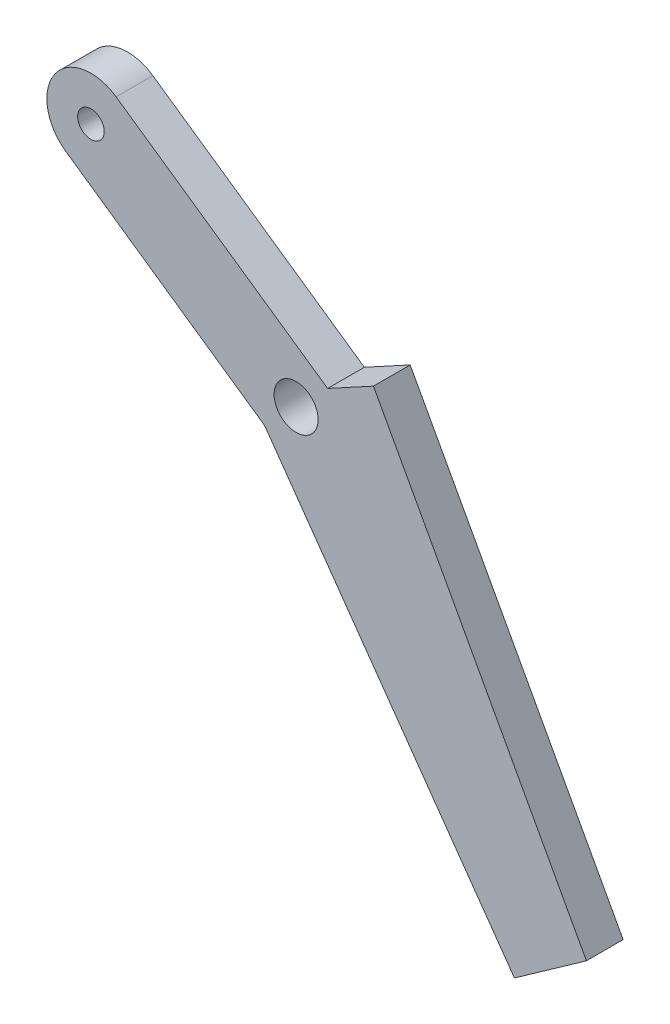
ISO-10303-21;
HEADER;
FILE_DESCRIPTION(('STEP AP214'),'2;1');
FILE_NAME('part.step','',(''),(''),'','','');
FILE_SCHEMA(('AUTOMOTIVE_DESIGN { 1 0 10303 214 1 1 1 1 }'));
ENDSEC;
DATA;
#1=APPLICATION_CONTEXT('core data for automotive mechanical design processes');
#2=APPLICATION_PROTOCOL_DEFINITION('international standard','automotive_design',2000,#1);
#3=PRODUCT_CONTEXT('',#1,'mechanical');
#4=PRODUCT('Part','Part','',(#3));
#5=PRODUCT_RELATED_PRODUCT_CATEGORY('part','',(#4));
#6=PRODUCT_DEFINITION_FORMATION('','',#4);
#7=PRODUCT_DEFINITION_CONTEXT('part definition',#1,'design');
#8=PRODUCT_DEFINITION('design','',#6,#7);
#9=PRODUCT_DEFINITION_SHAPE('','',#8);
#10=(LENGTH_UNIT() NAMED_UNIT(*) SI_UNIT(.MILLI.,.METRE.));
#11=(NAMED_UNIT(*) PLANE_ANGLE_UNIT() SI_UNIT($,.RADIAN.));
#12=(NAMED_UNIT(*) SI_UNIT($,.STERADIAN.) SOLID_ANGLE_UNIT());
#13=UNCERTAINTY_MEASURE_WITH_UNIT(LENGTH_MEASURE(1.E-05),#10,'distance_accuracy_value','');
#14=(GEOMETRIC_REPRESENTATION_CONTEXT(3) GLOBAL_UNCERTAINTY_ASSIGNED_CONTEXT((#13)) GLOBAL_UNIT_ASSIGNED_CONTEXT((#10,
#11,#12)) REPRESENTATION_CONTEXT('',''));
#15=CARTESIAN_POINT('',(0.,0.,0.));
#16=DIRECTION('',(0.,0.,1.));
#17=DIRECTION('',(1.,0.,0.));
#18=AXIS2_PLACEMENT_3D('',#15,#16,#17);
#19=CARTESIAN_POINT('',(36.7403272001533,52.945063432731,2.5));
#20=DIRECTION('',(0.570112302985173,0.821566772687979,0.));
#21=DIRECTION('',(-0.821566772687979,0.570112302985173,0.));
#22=AXIS2_PLACEMENT_3D('',#19,#20,#21);
#23=PLANE('',#22);
#24=DIRECTION('',(0.821566772687979,-0.570112302985173,0.));
#25=VECTOR('',#24,1.);
#26=CARTESIAN_POINT('',(36.7403272001533,52.945063432731,0.));
#27=LINE('',#26,#25);
#28=CARTESIAN_POINT('',(176.598168195802,-44.1069090559931,0.));
#29=VERTEX_POINT('',#28);
#30=CARTESIAN_POINT('',(190.999396496933,-54.1003967498914,0.));
#31=VERTEX_POINT('',#30);
#32=EDGE_CURVE('E142',#29,#31,#27,.T.);
#33=ORIENTED_EDGE('',*,*,#32,.F.);
#34=DIRECTION('',(0.,0.,-1.));
#35=VECTOR('',#34,1.);
#36=CARTESIAN_POINT('',(176.598168195802,-44.1069090559931,2.5));
#37=LINE('',#36,#35);
#38=CARTESIAN_POINT('',(176.598168195802,-44.1069090559931,2.5));
#39=VERTEX_POINT('',#38);
#40=EDGE_CURVE('E11',#39,#29,#37,.T.);
#41=ORIENTED_EDGE('',*,*,#40,.F.);
#42=DIRECTION('',(0.821566772687979,-0.570112302985173,0.));
#43=VECTOR('',#42,1.);
#44=CARTESIAN_POINT('',(36.7403272001533,52.945063432731,2.5));
#45=LINE('',#44,#43);
#46=CARTESIAN_POINT('',(190.999396496933,-54.1003967498914,2.5));
#47=VERTEX_POINT('',#46);
#48=EDGE_CURVE('E206',#39,#47,#45,.T.);
#49=ORIENTED_EDGE('',*,*,#48,.T.);
#50=DIRECTION('',(0.,0.,-1.));
#51=VECTOR('',#50,1.);
#52=CARTESIAN_POINT('',(190.999396496933,-54.1003967498914,2.5));
#53=LINE('',#52,#51);
#54=EDGE_CURVE('E52',#47,#31,#53,.T.);
#55=ORIENTED_EDGE('',*,*,#54,.T.);
#56=EDGE_LOOP('',(#33,#41,#49,#55));
#57=FACE_BOUND('',#56,.T.);
#58=ADVANCED_FACE('F35',(#57),#23,.T.);
#59=CARTESIAN_POINT('',(174.887831286847,-46.571609374057,2.5));
#60=DIRECTION('',(0.,0.,-1.));
#61=DIRECTION('',(-1.,0.,0.));
#62=AXIS2_PLACEMENT_3D('',#59,#60,#61);
#63=CYLINDRICAL_SURFACE('',#62,2.99999999999999);
#64=CARTESIAN_POINT('',(174.887831286847,-46.571609374057,0.));
#65=DIRECTION('',(0.,0.,1.));
#66=DIRECTION('',(1.,0.,0.));
#67=AXIS2_PLACEMENT_3D('',#64,#65,#66);
#68=CIRCLE('',#67,2.99999999999999);
#69=CARTESIAN_POINT('',(173.177494377891,-49.036309692121,0.));
#70=VERTEX_POINT('',#69);
#71=EDGE_CURVE('E139',#29,#70,#68,.T.);
#72=ORIENTED_EDGE('',*,*,#71,.T.);
#73=DIRECTION('',(0.,0.,-1.));
#74=VECTOR('',#73,1.);
#75=CARTESIAN_POINT('',(173.177494377891,-49.036309692121,2.5));
#76=LINE('',#75,#74);
#77=CARTESIAN_POINT('',(173.177494377891,-49.036309692121,2.5));
#78=VERTEX_POINT('',#77);
#79=EDGE_CURVE('E44',#78,#70,#76,.T.);
#80=ORIENTED_EDGE('',*,*,#79,.F.);
#81=CARTESIAN_POINT('',(174.887831286847,-46.571609374057,2.5));
#82=DIRECTION('',(0.,0.,1.));
#83=DIRECTION('',(1.,0.,0.));
#84=AXIS2_PLACEMENT_3D('',#81,#82,#83);
#85=CIRCLE('',#84,2.99999999999999);
#86=EDGE_CURVE('E208',#39,#78,#85,.T.);
#87=ORIENTED_EDGE('',*,*,#86,.F.);
#88=ORIENTED_EDGE('',*,*,#40,.T.);
#89=EDGE_LOOP('',(#72,#80,#87,#88));
#90=FACE_BOUND('',#89,.T.);
#91=ADVANCED_FACE('F140',(#90),#63,.T.);
#92=CARTESIAN_POINT('',(33.3196533822423,48.0156627966031,2.5));
#93=DIRECTION('',(0.570112302985173,0.821566772687979,0.));
#94=DIRECTION('',(-0.821566772687979,0.570112302985173,0.));
#95=AXIS2_PLACEMENT_3D('',#92,#93,#94);
#96=PLANE('',#95);
#97=DIRECTION('',(0.82156677268798,-0.570112302985173,0.));
#98=VECTOR('',#97,1.);
#99=CARTESIAN_POINT('',(33.3196533822423,48.0156627966031,0.));
#100=LINE('',#99,#98);
#101=CARTESIAN_POINT('',(186.709536348152,-58.4266402997185,0.));
#102=VERTEX_POINT('',#101);
#103=EDGE_CURVE('E134',#70,#102,#100,.T.);
#104=ORIENTED_EDGE('',*,*,#103,.T.);
#105=DIRECTION('',(0.,0.,-1.));
#106=VECTOR('',#105,1.);
#107=CARTESIAN_POINT('',(186.709536348152,-58.4266402997185,2.5));
#108=LINE('',#107,#106);
#109=CARTESIAN_POINT('',(186.709536348152,-58.4266402997185,2.5));
#110=VERTEX_POINT('',#109);
#111=EDGE_CURVE('E121',#110,#102,#108,.T.);
#112=ORIENTED_EDGE('',*,*,#111,.F.);
#113=DIRECTION('',(0.82156677268798,-0.570112302985173,0.));
#114=VECTOR('',#113,1.);
#115=CARTESIAN_POINT('',(33.3196533822423,48.0156627966031,2.5));
#116=LINE('',#115,#114);
#117=EDGE_CURVE('E135',#78,#110,#116,.T.);
#118=ORIENTED_EDGE('',*,*,#117,.F.);
#119=ORIENTED_EDGE('',*,*,#79,.T.);
#120=EDGE_LOOP('',(#104,#112,#118,#119));
#121=FACE_BOUND('',#120,.T.);
#122=ADVANCED_FACE('F132',(#121),#96,.F.);
#123=CARTESIAN_POINT('',(97.0070354424607,68.5373410183082,2.5));
#124=DIRECTION('',(0.816722709480777,0.577030342199072,0.));
#125=DIRECTION('',(-0.577030342199072,0.816722709480777,0.));
#126=AXIS2_PLACEMENT_3D('',#123,#124,#125);
#127=PLANE('',#126);
#128=DIRECTION('',(0.577030342199073,-0.816722709480777,0.));
#129=VECTOR('',#128,1.);
#130=CARTESIAN_POINT('',(97.0070354424607,68.5373410183082,0.));
#131=LINE('',#130,#129);
#132=CARTESIAN_POINT('',(203.715208560072,-82.4962908358255,0.));
#133=VERTEX_POINT('',#132);
#134=EDGE_CURVE('E144',#102,#133,#131,.T.);
#135=ORIENTED_EDGE('',*,*,#134,.T.);
#136=DIRECTION('',(0.,0.,-1.));
#137=VECTOR('',#136,1.);
#138=CARTESIAN_POINT('',(203.715208560072,-82.4962908358255,2.5));
#139=LINE('',#138,#137);
#140=CARTESIAN_POINT('',(203.715208560072,-82.4962908358255,2.5));
#141=VERTEX_POINT('',#140);
#142=EDGE_CURVE('E119',#141,#133,#139,.T.);
#143=ORIENTED_EDGE('',*,*,#142,.F.);
#144=DIRECTION('',(0.577030342199073,-0.816722709480777,0.));
#145=VECTOR('',#144,1.);
#146=CARTESIAN_POINT('',(97.0070354424607,68.5373410183082,2.5));
#147=LINE('',#146,#145);
#148=EDGE_CURVE('E112',#110,#141,#147,.T.);
#149=ORIENTED_EDGE('',*,*,#148,.F.);
#150=ORIENTED_EDGE('',*,*,#111,.T.);
#151=EDGE_LOOP('',(#135,#143,#149,#150));
#152=FACE_BOUND('',#151,.T.);
#153=ADVANCED_FACE('F191',(#152),#127,.F.);
#154=CARTESIAN_POINT('',(106.708173117611,-151.033631854134,2.5));
#155=DIRECTION('',(-0.57703034219907,0.816722709480779,0.));
#156=DIRECTION('',(-0.816722709480779,-0.57703034219907,0.));
#157=AXIS2_PLACEMENT_3D('',#154,#155,#156);
#158=PLANE('',#157);
#159=DIRECTION('',(0.816722709480779,0.57703034219907,0.));
#160=VECTOR('',#159,1.);
#161=CARTESIAN_POINT('',(106.708173117611,-151.033631854134,0.));
#162=LINE('',#161,#160);
#163=CARTESIAN_POINT('',(208.615544816957,-79.0341087826311,0.));
#164=VERTEX_POINT('',#163);
#165=EDGE_CURVE('E118',#133,#164,#162,.T.);
#166=ORIENTED_EDGE('',*,*,#165,.T.);
#167=DIRECTION('',(0.,0.,-1.));
#168=VECTOR('',#167,1.);
#169=CARTESIAN_POINT('',(208.615544816957,-79.0341087826311,2.5));
#170=LINE('',#169,#168);
#171=CARTESIAN_POINT('',(208.615544816957,-79.0341087826311,2.5));
#172=VERTEX_POINT('',#171);
#173=EDGE_CURVE('E100',#172,#164,#170,.T.);
#174=ORIENTED_EDGE('',*,*,#173,.F.);
#175=DIRECTION('',(0.816722709480779,0.57703034219907,0.));
#176=VECTOR('',#175,1.);
#177=CARTESIAN_POINT('',(106.708173117611,-151.033631854134,2.5));
#178=LINE('',#177,#176);
#179=EDGE_CURVE('E105',#141,#172,#178,.T.);
#180=ORIENTED_EDGE('',*,*,#179,.F.);
#181=ORIENTED_EDGE('',*,*,#142,.T.);
#182=EDGE_LOOP('',(#166,#174,#180,#181));
#183=FACE_BOUND('',#182,.T.);
#184=ADVANCED_FACE('F117',(#183),#158,.F.);
#185=CARTESIAN_POINT('',(127.740995685432,69.5361116307564,2.5));
#186=DIRECTION('',(-0.878302210072713,-0.478105875075163,0.));
#187=DIRECTION('',(0.478105875075163,-0.878302210072713,0.));
#188=AXIS2_PLACEMENT_3D('',#185,#186,#187);
#189=PLANE('',#188);
#190=DIRECTION('',(-0.478105875075163,0.878302210072713,0.));
#191=VECTOR('',#190,1.);
#192=CARTESIAN_POINT('',(127.740995685432,69.5361116307564,0.));
#193=LINE('',#192,#191);
#194=CARTESIAN_POINT('',(194.118553111525,-52.4024765060244,0.));
#195=VERTEX_POINT('',#194);
#196=EDGE_CURVE('E153',#164,#195,#193,.T.);
#197=ORIENTED_EDGE('',*,*,#196,.T.);
#198=DIRECTION('',(0.,0.,-1.));
#199=VECTOR('',#198,1.);
#200=CARTESIAN_POINT('',(194.118553111525,-52.4024765060244,2.5));
#201=LINE('',#200,#199);
#202=CARTESIAN_POINT('',(194.118553111525,-52.4024765060244,2.5));
#203=VERTEX_POINT('',#202);
#204=EDGE_CURVE('E75',#203,#195,#201,.T.);
#205=ORIENTED_EDGE('',*,*,#204,.F.);
#206=DIRECTION('',(-0.478105875075163,0.878302210072713,0.));
#207=VECTOR('',#206,1.);
#208=CARTESIAN_POINT('',(127.740995685432,69.5361116307564,2.5));
#209=LINE('',#208,#207);
#210=EDGE_CURVE('E96',#172,#203,#209,.T.);
#211=ORIENTED_EDGE('',*,*,#210,.F.);
#212=ORIENTED_EDGE('',*,*,#173,.T.);
#213=EDGE_LOOP('',(#197,#205,#211,#212));
#214=FACE_BOUND('',#213,.T.);
#215=ADVANCED_FACE('F98',(#214),#189,.F.);
#216=CARTESIAN_POINT('',(66.3775574260927,-121.938588136781,2.5));
#217=DIRECTION('',(-0.478105875075164,0.878302210072713,0.));
#218=DIRECTION('',(-0.878302210072713,-0.478105875075164,0.));
#219=AXIS2_PLACEMENT_3D('',#216,#217,#218);
#220=PLANE('',#219);
#221=DIRECTION('',(0.878302210072713,0.478105875075164,0.));
#222=VECTOR('',#221,1.);
#223=CARTESIAN_POINT('',(66.3775574260927,-121.938588136781,0.));
#224=LINE('',#223,#222);
#225=EDGE_CURVE('E155',#31,#195,#224,.T.);
#226=ORIENTED_EDGE('',*,*,#225,.F.);
#227=ORIENTED_EDGE('',*,*,#54,.F.);
#228=DIRECTION('',(0.878302210072713,0.478105875075164,0.));
#229=VECTOR('',#228,1.);
#230=CARTESIAN_POINT('',(66.3775574260927,-121.938588136781,2.5));
#231=LINE('',#230,#229);
#232=EDGE_CURVE('E104',#47,#203,#231,.T.);
#233=ORIENTED_EDGE('',*,*,#232,.T.);
#234=ORIENTED_EDGE('',*,*,#204,.T.);
#235=EDGE_LOOP('',(#226,#227,#233,#234));
#236=FACE_BOUND('',#235,.T.);
#237=ADVANCED_FACE('F174',(#236),#220,.T.);
#238=CARTESIAN_POINT('',(188.854466422543,-56.263518524805,2.5));
#239=DIRECTION('',(0.,0.,-1.));
#240=DIRECTION('',(-1.,0.,0.));
#241=AXIS2_PLACEMENT_3D('',#238,#239,#240);
#242=CYLINDRICAL_SURFACE('',#241,1.5);
#243=CARTESIAN_POINT('',(188.854466422543,-56.263518524805,2.5));
#244=DIRECTION('',(0.,0.,1.));
#245=DIRECTION('',(1.,0.,0.));
#246=AXIS2_PLACEMENT_3D('',#243,#244,#245);
#247=CIRCLE('',#246,1.5);
#248=CARTESIAN_POINT('',(190.354466422543,-56.263518524805,2.5));
#249=VERTEX_POINT('',#248);
#250=EDGE_CURVE('E160',#249,#249,#247,.T.);
#251=ORIENTED_EDGE('',*,*,#250,.T.);
#252=EDGE_LOOP('',(#251));
#253=FACE_BOUND('',#252,.T.);
#254=CARTESIAN_POINT('',(188.854466422543,-56.263518524805,0.));
#255=DIRECTION('',(0.,0.,1.));
#256=DIRECTION('',(1.,0.,0.));
#257=AXIS2_PLACEMENT_3D('',#254,#255,#256);
#258=CIRCLE('',#257,1.5);
#259=CARTESIAN_POINT('',(190.354466422543,-56.263518524805,0.));
#260=VERTEX_POINT('',#259);
#261=EDGE_CURVE('E146',#260,#260,#258,.T.);
#262=ORIENTED_EDGE('',*,*,#261,.F.);
#263=EDGE_LOOP('',(#262));
#264=FACE_BOUND('',#263,.T.);
#265=ADVANCED_FACE('F37',(#253,#264),#242,.F.);
#266=CARTESIAN_POINT('',(174.887831286847,-46.571609374057,2.5));
#267=DIRECTION('',(0.,0.,-1.));
#268=DIRECTION('',(-1.,0.,0.));
#269=AXIS2_PLACEMENT_3D('',#266,#267,#268);
#270=CYLINDRICAL_SURFACE('',#269,0.901496021214135);
#271=CARTESIAN_POINT('',(174.887831286847,-46.571609374057,2.5));
#272=DIRECTION('',(0.,0.,1.));
#273=DIRECTION('',(1.,0.,0.));
#274=AXIS2_PLACEMENT_3D('',#271,#272,#273);
#275=CIRCLE('',#274,0.901496021214135);
#276=CARTESIAN_POINT('',(175.789327308061,-46.571609374057,2.5));
#277=VERTEX_POINT('',#276);
#278=EDGE_CURVE('E161',#277,#277,#275,.T.);
#279=ORIENTED_EDGE('',*,*,#278,.T.);
#280=EDGE_LOOP('',(#279));
#281=FACE_BOUND('',#280,.T.);
#282=CARTESIAN_POINT('',(174.887831286847,-46.571609374057,0.));
#283=DIRECTION('',(0.,0.,1.));
#284=DIRECTION('',(1.,0.,0.));
#285=AXIS2_PLACEMENT_3D('',#282,#283,#284);
#286=CIRCLE('',#285,0.901496021214135);
#287=CARTESIAN_POINT('',(175.789327308061,-46.571609374057,0.));
#288=VERTEX_POINT('',#287);
#289=EDGE_CURVE('E158',#288,#288,#286,.T.);
#290=ORIENTED_EDGE('',*,*,#289,.F.);
#291=EDGE_LOOP('',(#290));
#292=FACE_BOUND('',#291,.T.);
#293=ADVANCED_FACE('F173',(#281,#292),#270,.F.);
#294=CARTESIAN_POINT('',(0.,0.,2.5));
#295=DIRECTION('',(0.,0.,1.));
#296=DIRECTION('',(1.,0.,0.));
#297=AXIS2_PLACEMENT_3D('',#294,#295,#296);
#298=PLANE('',#297);
#299=ORIENTED_EDGE('',*,*,#250,.F.);
#300=EDGE_LOOP('',(#299));
#301=FACE_BOUND('',#300,.T.);
#302=ORIENTED_EDGE('',*,*,#48,.F.);
#303=ORIENTED_EDGE('',*,*,#86,.T.);
#304=ORIENTED_EDGE('',*,*,#117,.T.);
#305=ORIENTED_EDGE('',*,*,#148,.T.);
#306=ORIENTED_EDGE('',*,*,#179,.T.);
#307=ORIENTED_EDGE('',*,*,#210,.T.);
#308=ORIENTED_EDGE('',*,*,#232,.F.);
#309=EDGE_LOOP('',(#302,#303,#304,#305,#306,#307,#308));
#310=FACE_BOUND('',#309,.T.);
#311=ORIENTED_EDGE('',*,*,#278,.F.);
#312=EDGE_LOOP('',(#311));
#313=FACE_BOUND('',#312,.T.);
#314=ADVANCED_FACE('F109',(#301,#310,#313),#298,.T.);
#315=CARTESIAN_POINT('',(0.,0.,0.));
#316=DIRECTION('',(0.,0.,1.));
#317=DIRECTION('',(1.,0.,0.));
#318=AXIS2_PLACEMENT_3D('',#315,#316,#317);
#319=PLANE('',#318);
#320=ORIENTED_EDGE('',*,*,#261,.T.);
#321=EDGE_LOOP('',(#320));
#322=FACE_BOUND('',#321,.T.);
#323=ORIENTED_EDGE('',*,*,#32,.T.);
#324=ORIENTED_EDGE('',*,*,#225,.T.);
#325=ORIENTED_EDGE('',*,*,#196,.F.);
#326=ORIENTED_EDGE('',*,*,#165,.F.);
#327=ORIENTED_EDGE('',*,*,#134,.F.);
#328=ORIENTED_EDGE('',*,*,#103,.F.);
#329=ORIENTED_EDGE('',*,*,#71,.F.);
#330=EDGE_LOOP('',(#323,#324,#325,#326,#327,#328,#329));
#331=FACE_BOUND('',#330,.T.);
#332=ORIENTED_EDGE('',*,*,#289,.T.);
#333=EDGE_LOOP('',(#332));
#334=FACE_BOUND('',#333,.T.);
#335=ADVANCED_FACE('F170',(#322,#331,#334),#319,.F.);
#336=CLOSED_SHELL('',(#58,#91,#122,#153,#184,#215,#237,#265,#293,#314,#335));
#337=MANIFOLD_SOLID_BREP('B2',#336);
#338=ADVANCED_BREP_SHAPE_REPRESENTATION('',(#18,#337),#14);
#339=SHAPE_DEFINITION_REPRESENTATION(#9,#338);
ENDSEC;
END-ISO-10303-21;
